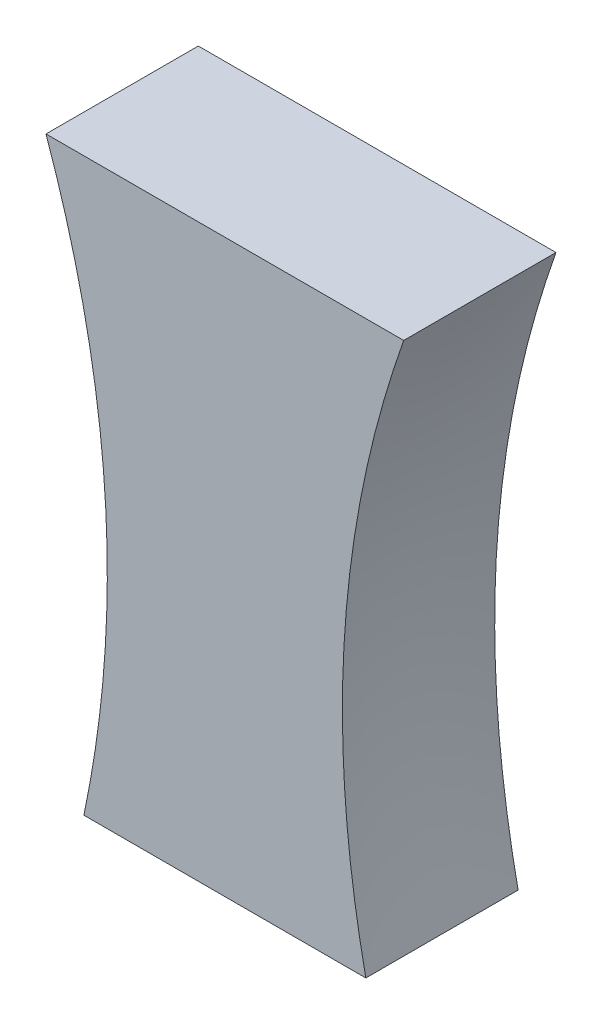
ISO-10303-21;
HEADER;
FILE_DESCRIPTION(('STEP AP214'),'2;1');
FILE_NAME('part.step','',(''),(''),'','','');
FILE_SCHEMA(('AUTOMOTIVE_DESIGN { 1 0 10303 214 1 1 1 1 }'));
ENDSEC;
DATA;
#1=APPLICATION_CONTEXT('core data for automotive mechanical design processes');
#2=APPLICATION_PROTOCOL_DEFINITION('international standard','automotive_design',2000,#1);
#3=PRODUCT_CONTEXT('',#1,'mechanical');
#4=PRODUCT('Part','Part','',(#3));
#5=PRODUCT_RELATED_PRODUCT_CATEGORY('part','',(#4));
#6=PRODUCT_DEFINITION_FORMATION('','',#4);
#7=PRODUCT_DEFINITION_CONTEXT('part definition',#1,'design');
#8=PRODUCT_DEFINITION('design','',#6,#7);
#9=PRODUCT_DEFINITION_SHAPE('','',#8);
#10=(LENGTH_UNIT() NAMED_UNIT(*) SI_UNIT(.MILLI.,.METRE.));
#11=(NAMED_UNIT(*) PLANE_ANGLE_UNIT() SI_UNIT($,.RADIAN.));
#12=(NAMED_UNIT(*) SI_UNIT($,.STERADIAN.) SOLID_ANGLE_UNIT());
#13=UNCERTAINTY_MEASURE_WITH_UNIT(LENGTH_MEASURE(1.E-05),#10,'distance_accuracy_value','');
#14=(GEOMETRIC_REPRESENTATION_CONTEXT(3) GLOBAL_UNCERTAINTY_ASSIGNED_CONTEXT((#13)) GLOBAL_UNIT_ASSIGNED_CONTEXT((#10,
#11,#12)) REPRESENTATION_CONTEXT('',''));
#15=CARTESIAN_POINT('',(0.,0.,0.));
#16=DIRECTION('',(0.,0.,1.));
#17=DIRECTION('',(1.,0.,0.));
#18=AXIS2_PLACEMENT_3D('',#15,#16,#17);
#19=CARTESIAN_POINT('',(0.,150.,0.));
#20=DIRECTION('',(0.,1.,0.));
#21=DIRECTION('',(0.,0.,1.));
#22=AXIS2_PLACEMENT_3D('',#19,#20,#21);
#23=PLANE('',#22);
#24=DIRECTION('',(0.,0.,1.));
#25=VECTOR('',#24,1.);
#26=CARTESIAN_POINT('',(-46.97281017059,150.,20.));
#27=LINE('',#26,#25);
#28=CARTESIAN_POINT('',(-46.97281017059,150.,-20.));
#29=VERTEX_POINT('',#28);
#30=CARTESIAN_POINT('',(-46.97281017059,150.,20.));
#31=VERTEX_POINT('',#30);
#32=EDGE_CURVE('E264',#29,#31,#27,.T.);
#33=ORIENTED_EDGE('',*,*,#32,.T.);
#34=DIRECTION('',(1.,0.,0.));
#35=VECTOR('',#34,1.);
#36=CARTESIAN_POINT('',(46.97281017059,150.,20.));
#37=LINE('',#36,#35);
#38=CARTESIAN_POINT('',(46.97281017059,150.,20.));
#39=VERTEX_POINT('',#38);
#40=EDGE_CURVE('E13',#31,#39,#37,.T.);
#41=ORIENTED_EDGE('',*,*,#40,.T.);
#42=DIRECTION('',(0.,0.,-1.));
#43=VECTOR('',#42,1.);
#44=CARTESIAN_POINT('',(46.97281017059,150.,20.));
#45=LINE('',#44,#43);
#46=CARTESIAN_POINT('',(46.97281017059,150.,-20.));
#47=VERTEX_POINT('',#46);
#48=EDGE_CURVE('E149',#39,#47,#45,.T.);
#49=ORIENTED_EDGE('',*,*,#48,.T.);
#50=DIRECTION('',(-1.,0.,0.));
#51=VECTOR('',#50,1.);
#52=CARTESIAN_POINT('',(46.97281017059,150.,-20.));
#53=LINE('',#52,#51);
#54=EDGE_CURVE('E301',#47,#29,#53,.T.);
#55=ORIENTED_EDGE('',*,*,#54,.T.);
#56=EDGE_LOOP('',(#33,#41,#49,#55));
#57=FACE_BOUND('',#56,.T.);
#58=ADVANCED_FACE('F137',(#57),#23,.T.);
#59=CARTESIAN_POINT('',(0.,0.,0.));
#60=DIRECTION('',(0.,1.,0.));
#61=DIRECTION('',(0.,0.,1.));
#62=AXIS2_PLACEMENT_3D('',#59,#60,#61);
#63=PLANE('',#62);
#64=DIRECTION('',(0.,0.,1.));
#65=VECTOR('',#64,1.);
#66=CARTESIAN_POINT('',(-37.0278637770898,0.,20.));
#67=LINE('',#66,#65);
#68=CARTESIAN_POINT('',(-37.0278637770898,0.,-20.));
#69=VERTEX_POINT('',#68);
#70=CARTESIAN_POINT('',(-37.0278637770898,0.,20.));
#71=VERTEX_POINT('',#70);
#72=EDGE_CURVE('E252',#69,#71,#67,.T.);
#73=ORIENTED_EDGE('',*,*,#72,.F.);
#74=DIRECTION('',(-1.,0.,0.));
#75=VECTOR('',#74,1.);
#76=CARTESIAN_POINT('',(37.0278637770898,0.,-20.));
#77=LINE('',#76,#75);
#78=CARTESIAN_POINT('',(37.0278637770898,0.,-20.));
#79=VERTEX_POINT('',#78);
#80=EDGE_CURVE('E208',#79,#69,#77,.T.);
#81=ORIENTED_EDGE('',*,*,#80,.F.);
#82=DIRECTION('',(0.,0.,-1.));
#83=VECTOR('',#82,1.);
#84=CARTESIAN_POINT('',(37.0278637770898,0.,20.));
#85=LINE('',#84,#83);
#86=CARTESIAN_POINT('',(37.0278637770898,0.,20.));
#87=VERTEX_POINT('',#86);
#88=EDGE_CURVE('E188',#87,#79,#85,.T.);
#89=ORIENTED_EDGE('',*,*,#88,.F.);
#90=DIRECTION('',(1.,0.,0.));
#91=VECTOR('',#90,1.);
#92=CARTESIAN_POINT('',(37.0278637770898,0.,20.));
#93=LINE('',#92,#91);
#94=EDGE_CURVE('E195',#71,#87,#93,.T.);
#95=ORIENTED_EDGE('',*,*,#94,.F.);
#96=EDGE_LOOP('',(#73,#81,#89,#95));
#97=FACE_BOUND('',#96,.T.);
#98=ADVANCED_FACE('F207',(#97),#63,.F.);
#99=CARTESIAN_POINT('',(-37.0278637770898,0.,-20.));
#100=CARTESIAN_POINT('',(-26.294954973935,50.8736569837526,-20.));
#101=CARTESIAN_POINT('',(-29.6099371051017,100.873656983753,-20.));
#102=CARTESIAN_POINT('',(-46.97281017059,150.,-20.));
#103=CARTESIAN_POINT('',(-37.0278637770898,0.,-18.4810575117784));
#104=CARTESIAN_POINT('',(-25.933955294587,50.8736569837526,-18.3739876429323));
#105=CARTESIAN_POINT('',(-29.2489374257538,100.873656983753,-18.2669177740862));
#106=CARTESIAN_POINT('',(-46.97281017059,150.,-18.1598479052401));
#107=CARTESIAN_POINT('',(-37.0278637770897,0.,-15.3185938599251));
#108=CARTESIAN_POINT('',(-25.2847160834796,50.8736569837526,-15.1068468917047));
#109=CARTESIAN_POINT('',(-28.5996982146463,100.873656983753,-14.8950999234843));
#110=CARTESIAN_POINT('',(-46.97281017059,150.,-14.6833529552639));
#111=CARTESIAN_POINT('',(-37.0278637770899,0.,-10.2733122252554));
#112=CARTESIAN_POINT('',(-24.5553723679568,50.8736569837526,-10.0998879779342));
#113=CARTESIAN_POINT('',(-27.8703544991235,100.873656983753,-9.92646373061298));
#114=CARTESIAN_POINT('',(-46.97281017059,150.,-9.75303948329177));
#115=CARTESIAN_POINT('',(-37.0278637770897,0.,-5.08301845792945));
#116=CARTESIAN_POINT('',(-24.0967784119448,50.8736569837526,-5.02980470832771));
#117=CARTESIAN_POINT('',(-27.4117605431116,100.873656983753,-4.97659095872598));
#118=CARTESIAN_POINT('',(-46.97281017059,150.,-4.92337720912424));
#119=CARTESIAN_POINT('',(-37.0278637770898,0.,-1.66666666666666));
#120=CARTESIAN_POINT('',(-23.9890387198594,50.8736569837526,-1.66666666666666));
#121=CARTESIAN_POINT('',(-27.3040208510261,100.873656983753,-1.66666666666666));
#122=CARTESIAN_POINT('',(-46.97281017059,150.,-1.66666666666666));
#123=CARTESIAN_POINT('',(-37.0278637770898,0.,0.));
#124=CARTESIAN_POINT('',(-23.9890387198594,50.8736569837526,0.));
#125=CARTESIAN_POINT('',(-27.3040208510261,100.873656983753,0.));
#126=CARTESIAN_POINT('',(-46.97281017059,150.,0.));
#127=CARTESIAN_POINT('',(-37.0278637770898,0.,1.66666666666666));
#128=CARTESIAN_POINT('',(-23.9890387198594,50.8736569837526,1.66666666666666));
#129=CARTESIAN_POINT('',(-27.3040208510261,100.873656983753,1.66666666666666));
#130=CARTESIAN_POINT('',(-46.97281017059,150.,1.66666666666667));
#131=CARTESIAN_POINT('',(-37.0278637770898,0.,5.08301845792944));
#132=CARTESIAN_POINT('',(-24.0967784119448,50.8736569837526,5.02980470832771));
#133=CARTESIAN_POINT('',(-27.4117605431116,100.873656983753,4.97659095872599));
#134=CARTESIAN_POINT('',(-46.97281017059,150.,4.92337720912426));
#135=CARTESIAN_POINT('',(-37.0278637770898,0.,10.2733122252554));
#136=CARTESIAN_POINT('',(-24.5553723679567,50.8736569837526,10.0998879779342));
#137=CARTESIAN_POINT('',(-27.8703544991235,100.873656983753,9.92646373061299));
#138=CARTESIAN_POINT('',(-46.97281017059,150.,9.75303948329178));
#139=CARTESIAN_POINT('',(-37.0278637770898,0.,15.3185938599251));
#140=CARTESIAN_POINT('',(-25.2847160834796,50.8736569837526,15.1068468917047));
#141=CARTESIAN_POINT('',(-28.5996982146463,100.873656983753,14.8950999234843));
#142=CARTESIAN_POINT('',(-46.97281017059,150.,14.6833529552639));
#143=CARTESIAN_POINT('',(-37.0278637770898,0.,18.4810575117784));
#144=CARTESIAN_POINT('',(-25.933955294587,50.8736569837526,18.3739876429323));
#145=CARTESIAN_POINT('',(-29.2489374257537,100.873656983753,18.2669177740862));
#146=CARTESIAN_POINT('',(-46.97281017059,150.,18.1598479052401));
#147=CARTESIAN_POINT('',(-37.0278637770898,0.,20.));
#148=CARTESIAN_POINT('',(-26.2949549739349,50.8736569837526,20.));
#149=CARTESIAN_POINT('',(-29.6099371051017,100.873656983753,20.));
#150=CARTESIAN_POINT('',(-46.97281017059,150.,20.));
#151=B_SPLINE_SURFACE_WITH_KNOTS('',3,3,((#99,#100,#101,#102),(#103,#104,#105,#106),(#107,#108,
#109,#110),(#111,#112,#113,#114),(#115,#116,#117,#118),(#119,#120,#121,#122),(#123,#124,#125,
#126),(#127,#128,#129,#130),(#131,#132,#133,#134),(#135,#136,#137,#138),(#139,#140,#141,#142),
(#143,#144,#145,#146),(#147,#148,#149,#150)),.UNSPECIFIED.,.F.,.F.,.F.,(4,1,1,1,3,1,1,1,4),(4,
4),(0.837666398428094,0.857958098624582,0.878249798821071,0.898541499017559,0.918833199214047,
0.939124899410535,0.959416599607024,0.979708299803512,1.),(0.,1.),.UNSPECIFIED.);
#152=CARTESIAN_POINT('',(-37.0278637770898,0.,20.));
#153=CARTESIAN_POINT('',(-26.2949549739349,50.8736569837526,20.));
#154=CARTESIAN_POINT('',(-29.6099371051017,100.873656983753,20.));
#155=CARTESIAN_POINT('',(-46.97281017059,150.,20.));
#156=B_SPLINE_CURVE_WITH_KNOTS('',3,(#152,#153,#154,#155),.UNSPECIFIED.,.F.,.F.,(4,4),(0.,1.),.UNSPECIFIED.);
#157=EDGE_CURVE('E157',#71,#31,#156,.T.);
#158=CARTESIAN_POINT('',(-37.0278637770898,0.,-20.));
#159=CARTESIAN_POINT('',(-26.294954973935,50.8736569837526,-20.));
#160=CARTESIAN_POINT('',(-29.6099371051017,100.873656983753,-20.));
#161=CARTESIAN_POINT('',(-46.97281017059,150.,-20.));
#162=B_SPLINE_CURVE_WITH_KNOTS('',3,(#158,#159,#160,#161),.UNSPECIFIED.,.F.,.F.,(4,4),(0.,1.),.UNSPECIFIED.);
#163=EDGE_CURVE('E336',#69,#29,#162,.T.);
#164=ORIENTED_EDGE('',*,*,#72,.T.);
#165=ORIENTED_EDGE('',*,*,#157,.T.);
#166=ORIENTED_EDGE('',*,*,#32,.F.);
#167=ORIENTED_EDGE('',*,*,#163,.F.);
#168=EDGE_LOOP('',(#164,#165,#166,#167));
#169=FACE_BOUND('',#168,.T.);
#170=ADVANCED_FACE('F228',(#169),#151,.T.);
#171=CARTESIAN_POINT('',(37.0278637770898,0.,-20.));
#172=DIRECTION('',(0.,0.,-1.));
#173=DIRECTION('',(-1.,0.,0.));
#174=AXIS2_PLACEMENT_3D('',#171,#172,#173);
#175=PLANE('',#174);
#176=ORIENTED_EDGE('',*,*,#80,.T.);
#177=ORIENTED_EDGE('',*,*,#163,.T.);
#178=ORIENTED_EDGE('',*,*,#54,.F.);
#179=CARTESIAN_POINT('',(37.0278637770898,0.,-20.));
#180=CARTESIAN_POINT('',(26.2949549739349,50.8736569837526,-20.));
#181=CARTESIAN_POINT('',(29.6099371051016,100.873656983753,-20.));
#182=CARTESIAN_POINT('',(46.97281017059,150.,-20.));
#183=B_SPLINE_CURVE_WITH_KNOTS('',3,(#179,#180,#181,#182),.UNSPECIFIED.,.F.,.F.,(4,4),(0.,1.),.UNSPECIFIED.);
#184=EDGE_CURVE('E194',#79,#47,#183,.T.);
#185=ORIENTED_EDGE('',*,*,#184,.F.);
#186=EDGE_LOOP('',(#176,#177,#178,#185));
#187=FACE_BOUND('',#186,.T.);
#188=ADVANCED_FACE('F288',(#187),#175,.T.);
#189=CARTESIAN_POINT('',(37.0278637770898,0.,20.));
#190=CARTESIAN_POINT('',(26.2949549739349,50.8736569837526,20.));
#191=CARTESIAN_POINT('',(29.6099371051017,100.873656983753,20.));
#192=CARTESIAN_POINT('',(46.97281017059,150.,20.));
#193=CARTESIAN_POINT('',(37.0278637770898,0.,18.4810575117784));
#194=CARTESIAN_POINT('',(25.9339552945869,50.8736569837526,18.3739876429323));
#195=CARTESIAN_POINT('',(29.2489374257537,100.873656983753,18.2669177740862));
#196=CARTESIAN_POINT('',(46.97281017059,150.,18.1598479052402));
#197=CARTESIAN_POINT('',(37.0278637770898,0.,15.3185938599251));
#198=CARTESIAN_POINT('',(25.2847160834796,50.8736569837525,15.1068468917047));
#199=CARTESIAN_POINT('',(28.5996982146463,100.873656983752,14.8950999234843));
#200=CARTESIAN_POINT('',(46.97281017059,150.,14.6833529552639));
#201=CARTESIAN_POINT('',(37.0278637770898,0.,10.2733122252554));
#202=CARTESIAN_POINT('',(24.5553723679567,50.8736569837527,10.0998879779342));
#203=CARTESIAN_POINT('',(27.8703544991235,100.873656983753,9.926463730613));
#204=CARTESIAN_POINT('',(46.97281017059,150.,9.7530394832918));
#205=CARTESIAN_POINT('',(37.0278637770898,0.,5.08301845792943));
#206=CARTESIAN_POINT('',(24.0967784119448,50.8736569837526,5.0298047083277));
#207=CARTESIAN_POINT('',(27.4117605431115,100.873656983753,4.97659095872597));
#208=CARTESIAN_POINT('',(46.9728101705899,150.,4.92337720912426));
#209=CARTESIAN_POINT('',(37.0278637770898,0.,1.66666666666666));
#210=CARTESIAN_POINT('',(23.9890387198594,50.8736569837526,1.66666666666666));
#211=CARTESIAN_POINT('',(27.3040208510261,100.873656983753,1.66666666666666));
#212=CARTESIAN_POINT('',(46.97281017059,150.,1.66666666666667));
#213=CARTESIAN_POINT('',(37.0278637770898,0.,-1.66666666666667));
#214=CARTESIAN_POINT('',(23.9890387198594,50.8736569837526,-1.66666666666667));
#215=CARTESIAN_POINT('',(27.3040208510261,100.873656983753,-1.66666666666667));
#216=CARTESIAN_POINT('',(46.97281017059,150.,-1.66666666666666));
#217=CARTESIAN_POINT('',(37.0278637770898,0.,-5.08301845792944));
#218=CARTESIAN_POINT('',(24.0967784119448,50.8736569837526,-5.02980470832771));
#219=CARTESIAN_POINT('',(27.4117605431115,100.873656983753,-4.97659095872598));
#220=CARTESIAN_POINT('',(46.97281017059,150.,-4.92337720912424));
#221=CARTESIAN_POINT('',(37.0278637770898,0.,-10.2733122252554));
#222=CARTESIAN_POINT('',(24.5553723679567,50.8736569837526,-10.0998879779342));
#223=CARTESIAN_POINT('',(27.8703544991234,100.873656983753,-9.92646373061301));
#224=CARTESIAN_POINT('',(46.97281017059,150.,-9.75303948329178));
#225=CARTESIAN_POINT('',(37.0278637770898,0.,-15.3185938599251));
#226=CARTESIAN_POINT('',(25.2847160834795,50.8736569837526,-15.1068468917047));
#227=CARTESIAN_POINT('',(28.5996982146463,100.873656983753,-14.8950999234843));
#228=CARTESIAN_POINT('',(46.97281017059,150.,-14.6833529552639));
#229=CARTESIAN_POINT('',(37.0278637770898,0.,-18.4810575117784));
#230=CARTESIAN_POINT('',(25.9339552945869,50.8736569837526,-18.3739876429323));
#231=CARTESIAN_POINT('',(29.2489374257537,100.873656983753,-18.2669177740862));
#232=CARTESIAN_POINT('',(46.97281017059,150.,-18.1598479052401));
#233=CARTESIAN_POINT('',(37.0278637770898,0.,-20.));
#234=CARTESIAN_POINT('',(26.2949549739349,50.8736569837526,-20.));
#235=CARTESIAN_POINT('',(29.6099371051016,100.873656983753,-20.));
#236=CARTESIAN_POINT('',(46.97281017059,150.,-20.));
#237=B_SPLINE_SURFACE_WITH_KNOTS('',3,3,((#189,#190,#191,#192),(#193,#194,#195,#196),(#197,#198,
#199,#200),(#201,#202,#203,#204),(#205,#206,#207,#208),(#209,#210,#211,#212),(#213,#214,#215,
#216),(#217,#218,#219,#220),(#221,#222,#223,#224),(#225,#226,#227,#228),(#229,#230,#231,#232),
(#233,#234,#235,#236)),.UNSPECIFIED.,.F.,.F.,.F.,(4,1,1,1,2,1,1,1,4),(4,4),(0.337666398428094,
0.357958098624582,0.378249798821071,0.398541499017559,0.418833199214047,0.439124899410535,
0.459416599607024,0.479708299803512,0.5),(0.,1.),.UNSPECIFIED.);
#238=CARTESIAN_POINT('',(37.0278637770898,0.,20.));
#239=CARTESIAN_POINT('',(26.2949549739349,50.8736569837526,20.));
#240=CARTESIAN_POINT('',(29.6099371051017,100.873656983753,20.));
#241=CARTESIAN_POINT('',(46.97281017059,150.,20.));
#242=B_SPLINE_CURVE_WITH_KNOTS('',3,(#238,#239,#240,#241),.UNSPECIFIED.,.F.,.F.,(4,4),(0.,1.),.UNSPECIFIED.);
#243=EDGE_CURVE('E183',#87,#39,#242,.T.);
#244=ORIENTED_EDGE('',*,*,#88,.T.);
#245=ORIENTED_EDGE('',*,*,#184,.T.);
#246=ORIENTED_EDGE('',*,*,#48,.F.);
#247=ORIENTED_EDGE('',*,*,#243,.F.);
#248=EDGE_LOOP('',(#244,#245,#246,#247));
#249=FACE_BOUND('',#248,.T.);
#250=ADVANCED_FACE('F185',(#249),#237,.T.);
#251=CARTESIAN_POINT('',(-37.0278637770898,0.,20.));
#252=DIRECTION('',(0.,0.,1.));
#253=DIRECTION('',(1.,0.,0.));
#254=AXIS2_PLACEMENT_3D('',#251,#252,#253);
#255=PLANE('',#254);
#256=ORIENTED_EDGE('',*,*,#94,.T.);
#257=ORIENTED_EDGE('',*,*,#243,.T.);
#258=ORIENTED_EDGE('',*,*,#40,.F.);
#259=ORIENTED_EDGE('',*,*,#157,.F.);
#260=EDGE_LOOP('',(#256,#257,#258,#259));
#261=FACE_BOUND('',#260,.T.);
#262=ADVANCED_FACE('F139',(#261),#255,.T.);
#263=CLOSED_SHELL('',(#58,#98,#170,#188,#250,#262));
#264=MANIFOLD_SOLID_BREP('B2',#263);
#265=ADVANCED_BREP_SHAPE_REPRESENTATION('',(#18,#264),#14);
#266=SHAPE_DEFINITION_REPRESENTATION(#9,#265);
ENDSEC;
END-ISO-10303-21;
